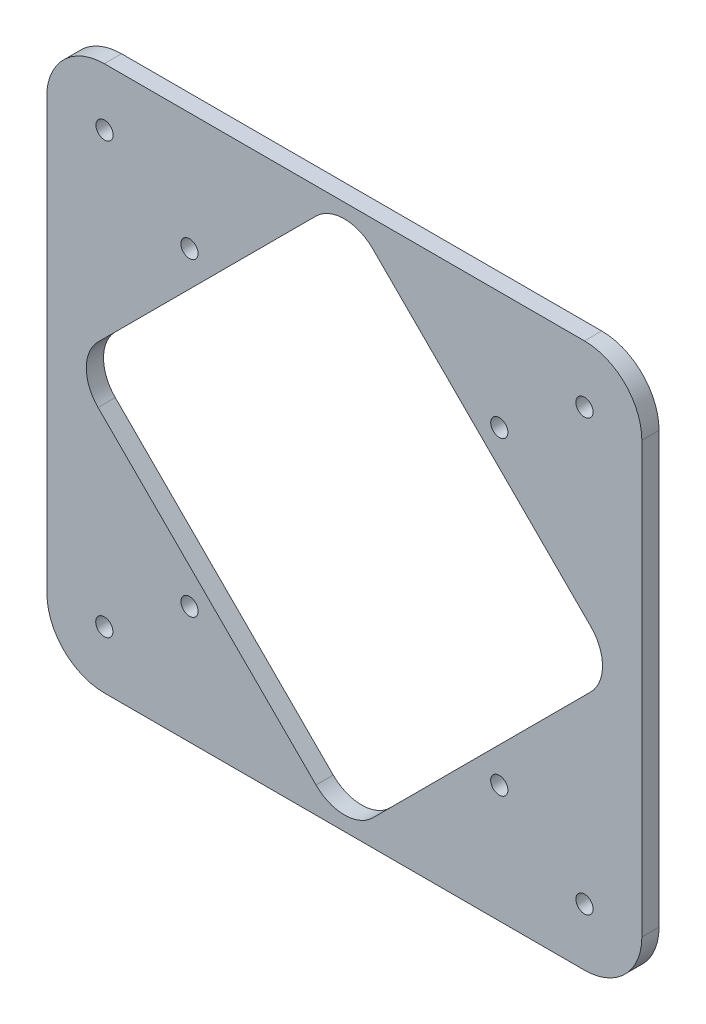
ISO-10303-21;
HEADER;
FILE_DESCRIPTION(('STEP AP214'),'2;1');
FILE_NAME('part.step','',(''),(''),'','','');
FILE_SCHEMA(('AUTOMOTIVE_DESIGN { 1 0 10303 214 1 1 1 1 }'));
ENDSEC;
DATA;
#1=APPLICATION_CONTEXT('core data for automotive mechanical design processes');
#2=APPLICATION_PROTOCOL_DEFINITION('international standard','automotive_design',2000,#1);
#3=PRODUCT_CONTEXT('',#1,'mechanical');
#4=PRODUCT('Part','Part','',(#3));
#5=PRODUCT_RELATED_PRODUCT_CATEGORY('part','',(#4));
#6=PRODUCT_DEFINITION_FORMATION('','',#4);
#7=PRODUCT_DEFINITION_CONTEXT('part definition',#1,'design');
#8=PRODUCT_DEFINITION('design','',#6,#7);
#9=PRODUCT_DEFINITION_SHAPE('','',#8);
#10=(LENGTH_UNIT() NAMED_UNIT(*) SI_UNIT(.MILLI.,.METRE.));
#11=(NAMED_UNIT(*) PLANE_ANGLE_UNIT() SI_UNIT($,.RADIAN.));
#12=(NAMED_UNIT(*) SI_UNIT($,.STERADIAN.) SOLID_ANGLE_UNIT());
#13=UNCERTAINTY_MEASURE_WITH_UNIT(LENGTH_MEASURE(1.E-05),#10,'distance_accuracy_value','');
#14=(GEOMETRIC_REPRESENTATION_CONTEXT(3) GLOBAL_UNCERTAINTY_ASSIGNED_CONTEXT((#13)) GLOBAL_UNIT_ASSIGNED_CONTEXT((#10,
#11,#12)) REPRESENTATION_CONTEXT('',''));
#15=CARTESIAN_POINT('',(0.,0.,0.));
#16=DIRECTION('',(0.,0.,1.));
#17=DIRECTION('',(1.,0.,0.));
#18=AXIS2_PLACEMENT_3D('',#15,#16,#17);
#19=CARTESIAN_POINT('',(142.00030989673,86.0001098961312,3.));
#20=DIRECTION('',(0.,0.,1.));
#21=DIRECTION('',(1.,0.,0.));
#22=AXIS2_PLACEMENT_3D('',#19,#20,#21);
#23=PLANE('',#22);
#24=CARTESIAN_POINT('',(73.150306055341,75.5000305458296,3.));
#25=DIRECTION('',(0.,0.,1.));
#26=DIRECTION('',(1.,0.,0.));
#27=AXIS2_PLACEMENT_3D('',#24,#25,#26);
#28=CIRCLE('',#27,1.5);
#29=CARTESIAN_POINT('',(74.650306055341,75.5000305458296,3.));
#30=VERTEX_POINT('',#29);
#31=EDGE_CURVE('E425',#30,#30,#28,.T.);
#32=ORIENTED_EDGE('',*,*,#31,.F.);
#33=EDGE_LOOP('',(#32));
#34=FACE_BOUND('',#33,.T.);
#35=CARTESIAN_POINT('',(142.00022454147,86.,3.));
#36=DIRECTION('',(0.,0.,1.));
#37=DIRECTION('',(1.,0.,0.));
#38=AXIS2_PLACEMENT_3D('',#35,#36,#37);
#39=CIRCLE('',#38,1.5);
#40=CARTESIAN_POINT('',(143.50022454147,86.,3.));
#41=VERTEX_POINT('',#40);
#42=EDGE_CURVE('E437',#41,#41,#39,.T.);
#43=ORIENTED_EDGE('',*,*,#42,.F.);
#44=EDGE_LOOP('',(#43));
#45=FACE_BOUND('',#44,.T.);
#46=CARTESIAN_POINT('',(142.00022454147,10.9999754582755,3.));
#47=DIRECTION('',(0.,0.,1.));
#48=DIRECTION('',(1.,0.,0.));
#49=AXIS2_PLACEMENT_3D('',#46,#47,#48);
#50=CIRCLE('',#49,1.5);
#51=CARTESIAN_POINT('',(143.50022454147,10.9999754582755,3.));
#52=VERTEX_POINT('',#51);
#53=EDGE_CURVE('E184',#52,#52,#50,.T.);
#54=ORIENTED_EDGE('',*,*,#53,.F.);
#55=EDGE_LOOP('',(#54));
#56=FACE_BOUND('',#55,.T.);
#57=CARTESIAN_POINT('',(73.150306055341,21.4999828091964,3.));
#58=DIRECTION('',(0.,0.,1.));
#59=DIRECTION('',(1.,0.,0.));
#60=AXIS2_PLACEMENT_3D('',#57,#58,#59);
#61=CIRCLE('',#60,1.5);
#62=CARTESIAN_POINT('',(74.650306055341,21.4999828091964,3.));
#63=VERTEX_POINT('',#62);
#64=EDGE_CURVE('E221',#63,#63,#61,.T.);
#65=ORIENTED_EDGE('',*,*,#64,.F.);
#66=EDGE_LOOP('',(#65));
#67=FACE_BOUND('',#66,.T.);
#68=CARTESIAN_POINT('',(142.00030989673,86.0001098961312,3.));
#69=DIRECTION('',(0.,0.,1.));
#70=DIRECTION('',(1.,0.,0.));
#71=AXIS2_PLACEMENT_3D('',#68,#69,#70);
#72=CIRCLE('',#71,9.99989010387377);
#73=CARTESIAN_POINT('',(152.0002,85.999999999886,3.));
#74=VERTEX_POINT('',#73);
#75=CARTESIAN_POINT('',(142.0003,96.0000000000001,3.));
#76=VERTEX_POINT('',#75);
#77=EDGE_CURVE('E227',#74,#76,#72,.T.);
#78=ORIENTED_EDGE('',*,*,#77,.T.);
#79=DIRECTION('',(-1.,0.,0.));
#80=VECTOR('',#79,1.);
#81=CARTESIAN_POINT('',(58.3003,95.9999999999999,3.));
#82=LINE('',#81,#80);
#83=CARTESIAN_POINT('',(58.3003,95.9999999999999,3.));
#84=VERTEX_POINT('',#83);
#85=EDGE_CURVE('E230',#76,#84,#82,.T.);
#86=ORIENTED_EDGE('',*,*,#85,.T.);
#87=CARTESIAN_POINT('',(58.3428128049057,85.8972079945477,3.));
#88=DIRECTION('',(0.,0.,1.));
#89=DIRECTION('',(1.,0.,0.));
#90=AXIS2_PLACEMENT_3D('',#87,#88,#89);
#91=CIRCLE('',#90,10.1028814525367);
#92=CARTESIAN_POINT('',(48.3002999999999,87.0000000000111,3.));
#93=VERTEX_POINT('',#92);
#94=EDGE_CURVE('E233',#84,#93,#91,.T.);
#95=ORIENTED_EDGE('',*,*,#94,.T.);
#96=DIRECTION('',(0.,-1.,0.));
#97=VECTOR('',#96,1.);
#98=CARTESIAN_POINT('',(48.3002999999999,87.0000000000111,3.));
#99=LINE('',#98,#97);
#100=CARTESIAN_POINT('',(48.3003,10.9999999999969,3.));
#101=VERTEX_POINT('',#100);
#102=EDGE_CURVE('E235',#93,#101,#99,.T.);
#103=ORIENTED_EDGE('',*,*,#102,.T.);
#104=CARTESIAN_POINT('',(58.3003608133547,11.0000608133547,3.));
#105=DIRECTION('',(0.,0.,1.));
#106=DIRECTION('',(1.,0.,0.));
#107=AXIS2_PLACEMENT_3D('',#104,#105,#106);
#108=CIRCLE('',#107,10.0000608135396);
#109=CARTESIAN_POINT('',(58.3003,1.,3.));
#110=VERTEX_POINT('',#109);
#111=EDGE_CURVE('E237',#101,#110,#108,.T.);
#112=ORIENTED_EDGE('',*,*,#111,.T.);
#113=DIRECTION('',(1.,0.,0.));
#114=VECTOR('',#113,1.);
#115=CARTESIAN_POINT('',(58.3003,1.,3.));
#116=LINE('',#115,#114);
#117=CARTESIAN_POINT('',(142.0003,0.999999999999963,3.));
#118=VERTEX_POINT('',#117);
#119=EDGE_CURVE('E239',#110,#118,#116,.T.);
#120=ORIENTED_EDGE('',*,*,#119,.T.);
#121=CARTESIAN_POINT('',(142.00022454147,10.9999754582755,3.));
#122=DIRECTION('',(0.,0.,1.));
#123=DIRECTION('',(1.,0.,0.));
#124=AXIS2_PLACEMENT_3D('',#121,#122,#123);
#125=CIRCLE('',#124,9.99997545856024);
#126=CARTESIAN_POINT('',(152.0002,10.9999999999346,3.));
#127=VERTEX_POINT('',#126);
#128=EDGE_CURVE('E241',#118,#127,#125,.T.);
#129=ORIENTED_EDGE('',*,*,#128,.T.);
#130=DIRECTION('',(0.,1.,0.));
#131=VECTOR('',#130,1.);
#132=CARTESIAN_POINT('',(152.0002,10.9999999999346,3.));
#133=LINE('',#132,#131);
#134=EDGE_CURVE('E243',#127,#74,#133,.T.);
#135=ORIENTED_EDGE('',*,*,#134,.T.);
#136=EDGE_LOOP('',(#78,#86,#95,#103,#112,#120,#129,#135));
#137=FACE_BOUND('',#136,.T.);
#138=CARTESIAN_POINT('',(58.3003,11.,3.));
#139=DIRECTION('',(0.,0.,1.));
#140=DIRECTION('',(1.,0.,0.));
#141=AXIS2_PLACEMENT_3D('',#138,#139,#140);
#142=CIRCLE('',#141,1.5);
#143=CARTESIAN_POINT('',(59.8003,11.,3.));
#144=VERTEX_POINT('',#143);
#145=EDGE_CURVE('E215',#144,#144,#142,.T.);
#146=ORIENTED_EDGE('',*,*,#145,.F.);
#147=EDGE_LOOP('',(#146));
#148=FACE_BOUND('',#147,.T.);
#149=CARTESIAN_POINT('',(138.141678028648,48.4999627321676,3.));
#150=DIRECTION('',(0.,0.,1.));
#151=DIRECTION('',(1.,0.,0.));
#152=AXIS2_PLACEMENT_3D('',#149,#150,#151);
#153=CIRCLE('',#152,7.00000000000008);
#154=CARTESIAN_POINT('',(143.091425496954,43.5502152638618,3.));
#155=VERTEX_POINT('',#154);
#156=CARTESIAN_POINT('',(143.091425496954,53.4497102004735,3.));
#157=VERTEX_POINT('',#156);
#158=EDGE_CURVE('E152',#155,#157,#153,.T.);
#159=ORIENTED_EDGE('',*,*,#158,.F.);
#160=DIRECTION('',(0.707106781186545,0.707106781186551,0.));
#161=VECTOR('',#160,1.);
#162=CARTESIAN_POINT('',(105.100047468306,5.55883723521331,3.));
#163=LINE('',#162,#161);
#164=CARTESIAN_POINT('',(105.100047468306,5.55883723521331,3.));
#165=VERTEX_POINT('',#164);
#166=EDGE_CURVE('E144',#165,#155,#163,.T.);
#167=ORIENTED_EDGE('',*,*,#166,.F.);
#168=CARTESIAN_POINT('',(100.1503,10.5085847035191,3.));
#169=DIRECTION('',(0.,0.,1.));
#170=DIRECTION('',(1.,0.,0.));
#171=AXIS2_PLACEMENT_3D('',#168,#169,#170);
#172=CIRCLE('',#171,6.99999999999999);
#173=CARTESIAN_POINT('',(95.2005525316941,5.55883723521335,3.));
#174=VERTEX_POINT('',#173);
#175=EDGE_CURVE('E180',#174,#165,#172,.T.);
#176=ORIENTED_EDGE('',*,*,#175,.F.);
#177=DIRECTION('',(0.707106781186548,-0.707106781186547,0.));
#178=VECTOR('',#177,1.);
#179=CARTESIAN_POINT('',(57.2091745030458,43.5502152638616,3.));
#180=LINE('',#179,#178);
#181=CARTESIAN_POINT('',(57.2091745030458,43.5502152638616,3.));
#182=VERTEX_POINT('',#181);
#183=EDGE_CURVE('E178',#182,#174,#180,.T.);
#184=ORIENTED_EDGE('',*,*,#183,.F.);
#185=CARTESIAN_POINT('',(62.1589219713516,48.4999627321675,3.));
#186=DIRECTION('',(0.,0.,1.));
#187=DIRECTION('',(1.,0.,0.));
#188=AXIS2_PLACEMENT_3D('',#185,#186,#187);
#189=CIRCLE('',#188,7.);
#190=CARTESIAN_POINT('',(57.2091745030457,53.4497102004733,3.));
#191=VERTEX_POINT('',#190);
#192=EDGE_CURVE('E176',#191,#182,#189,.T.);
#193=ORIENTED_EDGE('',*,*,#192,.F.);
#194=DIRECTION('',(-0.707106781186549,-0.707106781186547,0.));
#195=VECTOR('',#194,1.);
#196=CARTESIAN_POINT('',(95.2005525316942,91.4410882291217,3.));
#197=LINE('',#196,#195);
#198=CARTESIAN_POINT('',(95.2005525316942,91.4410882291217,3.));
#199=VERTEX_POINT('',#198);
#200=EDGE_CURVE('E174',#199,#191,#197,.T.);
#201=ORIENTED_EDGE('',*,*,#200,.F.);
#202=CARTESIAN_POINT('',(100.1503,86.4913407608158,3.));
#203=DIRECTION('',(0.,0.,1.));
#204=DIRECTION('',(1.,0.,0.));
#205=AXIS2_PLACEMENT_3D('',#202,#203,#204);
#206=CIRCLE('',#205,7.00000000000003);
#207=CARTESIAN_POINT('',(105.100047468306,91.4410882291217,3.));
#208=VERTEX_POINT('',#207);
#209=EDGE_CURVE('E169',#208,#199,#206,.T.);
#210=ORIENTED_EDGE('',*,*,#209,.F.);
#211=DIRECTION('',(-0.707106781186549,0.707106781186546,0.));
#212=VECTOR('',#211,1.);
#213=CARTESIAN_POINT('',(143.091425496954,53.4497102004735,3.));
#214=LINE('',#213,#212);
#215=EDGE_CURVE('E167',#157,#208,#214,.T.);
#216=ORIENTED_EDGE('',*,*,#215,.F.);
#217=EDGE_LOOP('',(#159,#167,#176,#184,#193,#201,#210,#216));
#218=FACE_BOUND('',#217,.T.);
#219=CARTESIAN_POINT('',(127.15030832697,21.4999828091964,3.));
#220=DIRECTION('',(0.,0.,1.));
#221=DIRECTION('',(1.,0.,0.));
#222=AXIS2_PLACEMENT_3D('',#219,#220,#221);
#223=CIRCLE('',#222,1.5);
#224=CARTESIAN_POINT('',(128.65030832697,21.4999828091964,3.));
#225=VERTEX_POINT('',#224);
#226=EDGE_CURVE('E443',#225,#225,#223,.T.);
#227=ORIENTED_EDGE('',*,*,#226,.F.);
#228=EDGE_LOOP('',(#227));
#229=FACE_BOUND('',#228,.T.);
#230=CARTESIAN_POINT('',(127.15030832697,75.5000305458296,3.));
#231=DIRECTION('',(0.,0.,1.));
#232=DIRECTION('',(1.,0.,0.));
#233=AXIS2_PLACEMENT_3D('',#230,#231,#232);
#234=CIRCLE('',#233,1.5);
#235=CARTESIAN_POINT('',(128.65030832697,75.5000305458296,3.));
#236=VERTEX_POINT('',#235);
#237=EDGE_CURVE('E431',#236,#236,#234,.T.);
#238=ORIENTED_EDGE('',*,*,#237,.F.);
#239=EDGE_LOOP('',(#238));
#240=FACE_BOUND('',#239,.T.);
#241=CARTESIAN_POINT('',(58.3427519915511,86.,3.));
#242=DIRECTION('',(0.,0.,1.));
#243=DIRECTION('',(1.,0.,0.));
#244=AXIS2_PLACEMENT_3D('',#241,#242,#243);
#245=CIRCLE('',#244,1.5);
#246=CARTESIAN_POINT('',(59.8427519915511,86.,3.));
#247=VERTEX_POINT('',#246);
#248=EDGE_CURVE('E416',#247,#247,#245,.T.);
#249=ORIENTED_EDGE('',*,*,#248,.F.);
#250=EDGE_LOOP('',(#249));
#251=FACE_BOUND('',#250,.T.);
#252=ADVANCED_FACE('F33',(#34,#45,#56,#67,#137,#148,#218,#229,#240,#251),#23,.T.);
#253=CARTESIAN_POINT('',(142.00030989673,86.0001098961312,0.));
#254=DIRECTION('',(0.,0.,1.));
#255=DIRECTION('',(1.,0.,0.));
#256=AXIS2_PLACEMENT_3D('',#253,#254,#255);
#257=PLANE('',#256);
#258=CARTESIAN_POINT('',(58.3003,11.,0.));
#259=DIRECTION('',(0.,0.,1.));
#260=DIRECTION('',(1.,0.,0.));
#261=AXIS2_PLACEMENT_3D('',#258,#259,#260);
#262=CIRCLE('',#261,1.5);
#263=CARTESIAN_POINT('',(59.8003,11.,0.));
#264=VERTEX_POINT('',#263);
#265=EDGE_CURVE('E161',#264,#264,#262,.T.);
#266=ORIENTED_EDGE('',*,*,#265,.T.);
#267=EDGE_LOOP('',(#266));
#268=FACE_BOUND('',#267,.T.);
#269=CARTESIAN_POINT('',(73.150306055341,21.4999828091964,0.));
#270=DIRECTION('',(0.,0.,1.));
#271=DIRECTION('',(1.,0.,0.));
#272=AXIS2_PLACEMENT_3D('',#269,#270,#271);
#273=CIRCLE('',#272,1.5);
#274=CARTESIAN_POINT('',(74.650306055341,21.4999828091964,0.));
#275=VERTEX_POINT('',#274);
#276=EDGE_CURVE('E218',#275,#275,#273,.T.);
#277=ORIENTED_EDGE('',*,*,#276,.T.);
#278=EDGE_LOOP('',(#277));
#279=FACE_BOUND('',#278,.T.);
#280=CARTESIAN_POINT('',(142.00030989673,86.0001098961312,0.));
#281=DIRECTION('',(0.,0.,1.));
#282=DIRECTION('',(1.,0.,0.));
#283=AXIS2_PLACEMENT_3D('',#280,#281,#282);
#284=CIRCLE('',#283,9.99989010387377);
#285=CARTESIAN_POINT('',(152.0002,85.999999999886,0.));
#286=VERTEX_POINT('',#285);
#287=CARTESIAN_POINT('',(142.0003,96.0000000000001,0.));
#288=VERTEX_POINT('',#287);
#289=EDGE_CURVE('E224',#286,#288,#284,.T.);
#290=ORIENTED_EDGE('',*,*,#289,.F.);
#291=DIRECTION('',(0.,1.,0.));
#292=VECTOR('',#291,1.);
#293=CARTESIAN_POINT('',(152.0002,10.9999999999346,0.));
#294=LINE('',#293,#292);
#295=CARTESIAN_POINT('',(152.0002,10.9999999999346,0.));
#296=VERTEX_POINT('',#295);
#297=EDGE_CURVE('E231',#296,#286,#294,.T.);
#298=ORIENTED_EDGE('',*,*,#297,.F.);
#299=CARTESIAN_POINT('',(142.00022454147,10.9999754582755,0.));
#300=DIRECTION('',(0.,0.,1.));
#301=DIRECTION('',(1.,0.,0.));
#302=AXIS2_PLACEMENT_3D('',#299,#300,#301);
#303=CIRCLE('',#302,9.99997545856024);
#304=CARTESIAN_POINT('',(142.0003,0.999999999999963,0.));
#305=VERTEX_POINT('',#304);
#306=EDGE_CURVE('E258',#305,#296,#303,.T.);
#307=ORIENTED_EDGE('',*,*,#306,.F.);
#308=DIRECTION('',(1.,0.,0.));
#309=VECTOR('',#308,1.);
#310=CARTESIAN_POINT('',(58.3003,1.,0.));
#311=LINE('',#310,#309);
#312=CARTESIAN_POINT('',(58.3003,1.,0.));
#313=VERTEX_POINT('',#312);
#314=EDGE_CURVE('E256',#313,#305,#311,.T.);
#315=ORIENTED_EDGE('',*,*,#314,.F.);
#316=CARTESIAN_POINT('',(58.3003608133547,11.0000608133547,0.));
#317=DIRECTION('',(0.,0.,1.));
#318=DIRECTION('',(1.,0.,0.));
#319=AXIS2_PLACEMENT_3D('',#316,#317,#318);
#320=CIRCLE('',#319,10.0000608135396);
#321=CARTESIAN_POINT('',(48.3003,10.9999999999969,0.));
#322=VERTEX_POINT('',#321);
#323=EDGE_CURVE('E254',#322,#313,#320,.T.);
#324=ORIENTED_EDGE('',*,*,#323,.F.);
#325=DIRECTION('',(0.,-1.,0.));
#326=VECTOR('',#325,1.);
#327=CARTESIAN_POINT('',(48.3002999999999,87.0000000000111,0.));
#328=LINE('',#327,#326);
#329=CARTESIAN_POINT('',(48.3002999999999,87.0000000000111,0.));
#330=VERTEX_POINT('',#329);
#331=EDGE_CURVE('E252',#330,#322,#328,.T.);
#332=ORIENTED_EDGE('',*,*,#331,.F.);
#333=CARTESIAN_POINT('',(58.3428128049057,85.8972079945477,0.));
#334=DIRECTION('',(0.,0.,1.));
#335=DIRECTION('',(1.,0.,0.));
#336=AXIS2_PLACEMENT_3D('',#333,#334,#335);
#337=CIRCLE('',#336,10.1028814525367);
#338=CARTESIAN_POINT('',(58.3003,95.9999999999999,0.));
#339=VERTEX_POINT('',#338);
#340=EDGE_CURVE('E250',#339,#330,#337,.T.);
#341=ORIENTED_EDGE('',*,*,#340,.F.);
#342=DIRECTION('',(-1.,0.,0.));
#343=VECTOR('',#342,1.);
#344=CARTESIAN_POINT('',(58.3003,95.9999999999999,0.));
#345=LINE('',#344,#343);
#346=EDGE_CURVE('E248',#288,#339,#345,.T.);
#347=ORIENTED_EDGE('',*,*,#346,.F.);
#348=EDGE_LOOP('',(#290,#298,#307,#315,#324,#332,#341,#347));
#349=FACE_BOUND('',#348,.T.);
#350=DIRECTION('',(0.70710678118655,0.707106781186545,0.));
#351=VECTOR('',#350,1.);
#352=CARTESIAN_POINT('',(124.449289873223,24.9080796401309,0.));
#353=LINE('',#352,#351);
#354=CARTESIAN_POINT('',(105.100047468306,5.55883723521331,0.));
#355=VERTEX_POINT('',#354);
#356=CARTESIAN_POINT('',(143.091425496954,43.5502152638618,0.));
#357=VERTEX_POINT('',#356);
#358=EDGE_CURVE('E182',#355,#357,#353,.T.);
#359=ORIENTED_EDGE('',*,*,#358,.T.);
#360=CARTESIAN_POINT('',(138.141678028648,48.4999627321676,0.));
#361=DIRECTION('',(0.,0.,1.));
#362=DIRECTION('',(1.,0.,0.));
#363=AXIS2_PLACEMENT_3D('',#360,#361,#362);
#364=CIRCLE('',#363,7.00000000000008);
#365=CARTESIAN_POINT('',(143.091425496954,53.4497102004735,0.));
#366=VERTEX_POINT('',#365);
#367=EDGE_CURVE('E159',#357,#366,#364,.T.);
#368=ORIENTED_EDGE('',*,*,#367,.T.);
#369=DIRECTION('',(-0.707106781186549,0.707106781186546,0.));
#370=VECTOR('',#369,1.);
#371=CARTESIAN_POINT('',(143.091425496954,53.4497102004735,0.));
#372=LINE('',#371,#370);
#373=CARTESIAN_POINT('',(105.100047468306,91.4410882291217,0.));
#374=VERTEX_POINT('',#373);
#375=EDGE_CURVE('E186',#366,#374,#372,.T.);
#376=ORIENTED_EDGE('',*,*,#375,.T.);
#377=CARTESIAN_POINT('',(100.1503,86.4913407608158,0.));
#378=DIRECTION('',(0.,0.,1.));
#379=DIRECTION('',(1.,0.,0.));
#380=AXIS2_PLACEMENT_3D('',#377,#378,#379);
#381=CIRCLE('',#380,7.00000000000003);
#382=CARTESIAN_POINT('',(95.2005525316942,91.4410882291217,0.));
#383=VERTEX_POINT('',#382);
#384=EDGE_CURVE('E189',#374,#383,#381,.T.);
#385=ORIENTED_EDGE('',*,*,#384,.T.);
#386=DIRECTION('',(-0.707106781186547,-0.707106781186548,0.));
#387=VECTOR('',#386,1.);
#388=CARTESIAN_POINT('',(76.5584169079632,72.7989526053908,0.));
#389=LINE('',#388,#387);
#390=CARTESIAN_POINT('',(57.2091745030457,53.4497102004733,0.));
#391=VERTEX_POINT('',#390);
#392=EDGE_CURVE('E192',#383,#391,#389,.T.);
#393=ORIENTED_EDGE('',*,*,#392,.T.);
#394=CARTESIAN_POINT('',(62.1589219713516,48.4999627321675,0.));
#395=DIRECTION('',(0.,0.,1.));
#396=DIRECTION('',(1.,0.,0.));
#397=AXIS2_PLACEMENT_3D('',#394,#395,#396);
#398=CIRCLE('',#397,7.);
#399=CARTESIAN_POINT('',(57.2091745030458,43.5502152638616,0.));
#400=VERTEX_POINT('',#399);
#401=EDGE_CURVE('E195',#391,#400,#398,.T.);
#402=ORIENTED_EDGE('',*,*,#401,.T.);
#403=DIRECTION('',(0.707106781186548,-0.707106781186547,0.));
#404=VECTOR('',#403,1.);
#405=CARTESIAN_POINT('',(57.2091745030458,43.5502152638616,0.));
#406=LINE('',#405,#404);
#407=CARTESIAN_POINT('',(95.2005525316941,5.55883723521335,0.));
#408=VERTEX_POINT('',#407);
#409=EDGE_CURVE('E198',#400,#408,#406,.T.);
#410=ORIENTED_EDGE('',*,*,#409,.T.);
#411=CARTESIAN_POINT('',(100.1503,10.5085847035191,0.));
#412=DIRECTION('',(0.,0.,1.));
#413=DIRECTION('',(1.,0.,0.));
#414=AXIS2_PLACEMENT_3D('',#411,#412,#413);
#415=CIRCLE('',#414,6.99999999999999);
#416=EDGE_CURVE('E153',#408,#355,#415,.T.);
#417=ORIENTED_EDGE('',*,*,#416,.T.);
#418=EDGE_LOOP('',(#359,#368,#376,#385,#393,#402,#410,#417));
#419=FACE_BOUND('',#418,.T.);
#420=CARTESIAN_POINT('',(142.00022454147,10.9999754582755,0.));
#421=DIRECTION('',(0.,0.,1.));
#422=DIRECTION('',(1.,0.,0.));
#423=AXIS2_PLACEMENT_3D('',#420,#421,#422);
#424=CIRCLE('',#423,1.5);
#425=CARTESIAN_POINT('',(143.50022454147,10.9999754582755,0.));
#426=VERTEX_POINT('',#425);
#427=EDGE_CURVE('E446',#426,#426,#424,.T.);
#428=ORIENTED_EDGE('',*,*,#427,.T.);
#429=EDGE_LOOP('',(#428));
#430=FACE_BOUND('',#429,.T.);
#431=CARTESIAN_POINT('',(127.15030832697,21.4999828091964,0.));
#432=DIRECTION('',(0.,0.,1.));
#433=DIRECTION('',(1.,0.,0.));
#434=AXIS2_PLACEMENT_3D('',#431,#432,#433);
#435=CIRCLE('',#434,1.5);
#436=CARTESIAN_POINT('',(128.65030832697,21.4999828091964,0.));
#437=VERTEX_POINT('',#436);
#438=EDGE_CURVE('E440',#437,#437,#435,.T.);
#439=ORIENTED_EDGE('',*,*,#438,.T.);
#440=EDGE_LOOP('',(#439));
#441=FACE_BOUND('',#440,.T.);
#442=CARTESIAN_POINT('',(142.00022454147,86.,0.));
#443=DIRECTION('',(0.,0.,1.));
#444=DIRECTION('',(1.,0.,0.));
#445=AXIS2_PLACEMENT_3D('',#442,#443,#444);
#446=CIRCLE('',#445,1.5);
#447=CARTESIAN_POINT('',(143.50022454147,86.,0.));
#448=VERTEX_POINT('',#447);
#449=EDGE_CURVE('E434',#448,#448,#446,.T.);
#450=ORIENTED_EDGE('',*,*,#449,.T.);
#451=EDGE_LOOP('',(#450));
#452=FACE_BOUND('',#451,.T.);
#453=CARTESIAN_POINT('',(127.15030832697,75.5000305458296,0.));
#454=DIRECTION('',(0.,0.,1.));
#455=DIRECTION('',(1.,0.,0.));
#456=AXIS2_PLACEMENT_3D('',#453,#454,#455);
#457=CIRCLE('',#456,1.5);
#458=CARTESIAN_POINT('',(128.65030832697,75.5000305458296,0.));
#459=VERTEX_POINT('',#458);
#460=EDGE_CURVE('E428',#459,#459,#457,.T.);
#461=ORIENTED_EDGE('',*,*,#460,.T.);
#462=EDGE_LOOP('',(#461));
#463=FACE_BOUND('',#462,.T.);
#464=CARTESIAN_POINT('',(73.150306055341,75.5000305458296,0.));
#465=DIRECTION('',(0.,0.,1.));
#466=DIRECTION('',(1.,0.,0.));
#467=AXIS2_PLACEMENT_3D('',#464,#465,#466);
#468=CIRCLE('',#467,1.5);
#469=CARTESIAN_POINT('',(74.650306055341,75.5000305458296,0.));
#470=VERTEX_POINT('',#469);
#471=EDGE_CURVE('E422',#470,#470,#468,.T.);
#472=ORIENTED_EDGE('',*,*,#471,.T.);
#473=EDGE_LOOP('',(#472));
#474=FACE_BOUND('',#473,.T.);
#475=CARTESIAN_POINT('',(58.3427519915511,86.,0.));
#476=DIRECTION('',(0.,0.,1.));
#477=DIRECTION('',(1.,0.,0.));
#478=AXIS2_PLACEMENT_3D('',#475,#476,#477);
#479=CIRCLE('',#478,1.5);
#480=CARTESIAN_POINT('',(59.8427519915511,86.,0.));
#481=VERTEX_POINT('',#480);
#482=EDGE_CURVE('E419',#481,#481,#479,.T.);
#483=ORIENTED_EDGE('',*,*,#482,.T.);
#484=EDGE_LOOP('',(#483));
#485=FACE_BOUND('',#484,.T.);
#486=ADVANCED_FACE('F288',(#268,#279,#349,#419,#430,#441,#452,#463,#474,#485),#257,.F.);
#487=CARTESIAN_POINT('',(142.00030989673,86.0001098961312,3.));
#488=DIRECTION('',(0.,0.,-1.));
#489=DIRECTION('',(-1.,0.,0.));
#490=AXIS2_PLACEMENT_3D('',#487,#488,#489);
#491=CYLINDRICAL_SURFACE('',#490,9.99989010387377);
#492=ORIENTED_EDGE('',*,*,#289,.T.);
#493=DIRECTION('',(0.,0.,-1.));
#494=VECTOR('',#493,1.);
#495=CARTESIAN_POINT('',(142.0003,96.0000000000001,3.));
#496=LINE('',#495,#494);
#497=EDGE_CURVE('E11',#76,#288,#496,.T.);
#498=ORIENTED_EDGE('',*,*,#497,.F.);
#499=ORIENTED_EDGE('',*,*,#77,.F.);
#500=DIRECTION('',(0.,0.,-1.));
#501=VECTOR('',#500,1.);
#502=CARTESIAN_POINT('',(152.0002,85.999999999886,3.));
#503=LINE('',#502,#501);
#504=EDGE_CURVE('E245',#74,#286,#503,.T.);
#505=ORIENTED_EDGE('',*,*,#504,.T.);
#506=EDGE_LOOP('',(#492,#498,#499,#505));
#507=FACE_BOUND('',#506,.T.);
#508=ADVANCED_FACE('F35',(#507),#491,.T.);
#509=CARTESIAN_POINT('',(58.3003,95.9999999999999,3.));
#510=DIRECTION('',(0.,-1.,0.));
#511=DIRECTION('',(1.,0.,0.));
#512=AXIS2_PLACEMENT_3D('',#509,#510,#511);
#513=PLANE('',#512);
#514=ORIENTED_EDGE('',*,*,#346,.T.);
#515=DIRECTION('',(0.,0.,-1.));
#516=VECTOR('',#515,1.);
#517=CARTESIAN_POINT('',(58.3003,95.9999999999999,3.));
#518=LINE('',#517,#516);
#519=EDGE_CURVE('E41',#84,#339,#518,.T.);
#520=ORIENTED_EDGE('',*,*,#519,.F.);
#521=ORIENTED_EDGE('',*,*,#85,.F.);
#522=ORIENTED_EDGE('',*,*,#497,.T.);
#523=EDGE_LOOP('',(#514,#520,#521,#522));
#524=FACE_BOUND('',#523,.T.);
#525=ADVANCED_FACE('F306',(#524),#513,.F.);
#526=CARTESIAN_POINT('',(58.3428128049057,85.8972079945477,3.));
#527=DIRECTION('',(0.,0.,-1.));
#528=DIRECTION('',(-1.,0.,0.));
#529=AXIS2_PLACEMENT_3D('',#526,#527,#528);
#530=CYLINDRICAL_SURFACE('',#529,10.1028814525367);
#531=ORIENTED_EDGE('',*,*,#340,.T.);
#532=DIRECTION('',(0.,0.,-1.));
#533=VECTOR('',#532,1.);
#534=CARTESIAN_POINT('',(48.3002999999999,87.0000000000111,3.));
#535=LINE('',#534,#533);
#536=EDGE_CURVE('E275',#93,#330,#535,.T.);
#537=ORIENTED_EDGE('',*,*,#536,.F.);
#538=ORIENTED_EDGE('',*,*,#94,.F.);
#539=ORIENTED_EDGE('',*,*,#519,.T.);
#540=EDGE_LOOP('',(#531,#537,#538,#539));
#541=FACE_BOUND('',#540,.T.);
#542=ADVANCED_FACE('F282',(#541),#530,.T.);
#543=CARTESIAN_POINT('',(48.3002999999999,87.0000000000111,3.));
#544=DIRECTION('',(1.,0.,0.));
#545=DIRECTION('',(0.,1.,0.));
#546=AXIS2_PLACEMENT_3D('',#543,#544,#545);
#547=PLANE('',#546);
#548=ORIENTED_EDGE('',*,*,#331,.T.);
#549=DIRECTION('',(0.,0.,-1.));
#550=VECTOR('',#549,1.);
#551=CARTESIAN_POINT('',(48.3003,10.9999999999969,3.));
#552=LINE('',#551,#550);
#553=EDGE_CURVE('E272',#101,#322,#552,.T.);
#554=ORIENTED_EDGE('',*,*,#553,.F.);
#555=ORIENTED_EDGE('',*,*,#102,.F.);
#556=ORIENTED_EDGE('',*,*,#536,.T.);
#557=EDGE_LOOP('',(#548,#554,#555,#556));
#558=FACE_BOUND('',#557,.T.);
#559=ADVANCED_FACE('F294',(#558),#547,.F.);
#560=CARTESIAN_POINT('',(58.3003608133547,11.0000608133547,3.));
#561=DIRECTION('',(0.,0.,-1.));
#562=DIRECTION('',(-1.,0.,0.));
#563=AXIS2_PLACEMENT_3D('',#560,#561,#562);
#564=CYLINDRICAL_SURFACE('',#563,10.0000608135396);
#565=ORIENTED_EDGE('',*,*,#323,.T.);
#566=DIRECTION('',(0.,0.,-1.));
#567=VECTOR('',#566,1.);
#568=CARTESIAN_POINT('',(58.3003,1.,3.));
#569=LINE('',#568,#567);
#570=EDGE_CURVE('E269',#110,#313,#569,.T.);
#571=ORIENTED_EDGE('',*,*,#570,.F.);
#572=ORIENTED_EDGE('',*,*,#111,.F.);
#573=ORIENTED_EDGE('',*,*,#553,.T.);
#574=EDGE_LOOP('',(#565,#571,#572,#573));
#575=FACE_BOUND('',#574,.T.);
#576=ADVANCED_FACE('F298',(#575),#564,.T.);
#577=CARTESIAN_POINT('',(58.3003,1.,3.));
#578=DIRECTION('',(0.,1.,0.));
#579=DIRECTION('',(-1.,0.,0.));
#580=AXIS2_PLACEMENT_3D('',#577,#578,#579);
#581=PLANE('',#580);
#582=ORIENTED_EDGE('',*,*,#314,.T.);
#583=DIRECTION('',(0.,0.,-1.));
#584=VECTOR('',#583,1.);
#585=CARTESIAN_POINT('',(142.0003,0.999999999999963,3.));
#586=LINE('',#585,#584);
#587=EDGE_CURVE('E266',#118,#305,#586,.T.);
#588=ORIENTED_EDGE('',*,*,#587,.F.);
#589=ORIENTED_EDGE('',*,*,#119,.F.);
#590=ORIENTED_EDGE('',*,*,#570,.T.);
#591=EDGE_LOOP('',(#582,#588,#589,#590));
#592=FACE_BOUND('',#591,.T.);
#593=ADVANCED_FACE('F319',(#592),#581,.F.);
#594=CARTESIAN_POINT('',(142.00022454147,10.9999754582755,3.));
#595=DIRECTION('',(0.,0.,-1.));
#596=DIRECTION('',(-1.,0.,0.));
#597=AXIS2_PLACEMENT_3D('',#594,#595,#596);
#598=CYLINDRICAL_SURFACE('',#597,9.99997545856024);
#599=ORIENTED_EDGE('',*,*,#306,.T.);
#600=DIRECTION('',(0.,0.,-1.));
#601=VECTOR('',#600,1.);
#602=CARTESIAN_POINT('',(152.0002,10.9999999999346,3.));
#603=LINE('',#602,#601);
#604=EDGE_CURVE('E263',#127,#296,#603,.T.);
#605=ORIENTED_EDGE('',*,*,#604,.F.);
#606=ORIENTED_EDGE('',*,*,#128,.F.);
#607=ORIENTED_EDGE('',*,*,#587,.T.);
#608=EDGE_LOOP('',(#599,#605,#606,#607));
#609=FACE_BOUND('',#608,.T.);
#610=ADVANCED_FACE('F317',(#609),#598,.T.);
#611=CARTESIAN_POINT('',(152.0002,10.9999999999346,3.));
#612=DIRECTION('',(-1.,0.,0.));
#613=DIRECTION('',(0.,-1.,0.));
#614=AXIS2_PLACEMENT_3D('',#611,#612,#613);
#615=PLANE('',#614);
#616=ORIENTED_EDGE('',*,*,#297,.T.);
#617=ORIENTED_EDGE('',*,*,#504,.F.);
#618=ORIENTED_EDGE('',*,*,#134,.F.);
#619=ORIENTED_EDGE('',*,*,#604,.T.);
#620=EDGE_LOOP('',(#616,#617,#618,#619));
#621=FACE_BOUND('',#620,.T.);
#622=ADVANCED_FACE('F312',(#621),#615,.F.);
#623=CARTESIAN_POINT('',(73.150306055341,21.4999828091964,3.));
#624=DIRECTION('',(0.,0.,-1.));
#625=DIRECTION('',(-1.,0.,0.));
#626=AXIS2_PLACEMENT_3D('',#623,#624,#625);
#627=CYLINDRICAL_SURFACE('',#626,1.5);
#628=ORIENTED_EDGE('',*,*,#64,.T.);
#629=EDGE_LOOP('',(#628));
#630=FACE_BOUND('',#629,.T.);
#631=ORIENTED_EDGE('',*,*,#276,.F.);
#632=EDGE_LOOP('',(#631));
#633=FACE_BOUND('',#632,.T.);
#634=ADVANCED_FACE('F339',(#630,#633),#627,.F.);
#635=CARTESIAN_POINT('',(58.3003,11.,3.));
#636=DIRECTION('',(0.,0.,-1.));
#637=DIRECTION('',(-1.,0.,0.));
#638=AXIS2_PLACEMENT_3D('',#635,#636,#637);
#639=CYLINDRICAL_SURFACE('',#638,1.5);
#640=ORIENTED_EDGE('',*,*,#145,.T.);
#641=EDGE_LOOP('',(#640));
#642=FACE_BOUND('',#641,.T.);
#643=ORIENTED_EDGE('',*,*,#265,.F.);
#644=EDGE_LOOP('',(#643));
#645=FACE_BOUND('',#644,.T.);
#646=ADVANCED_FACE('F346',(#642,#645),#639,.F.);
#647=CARTESIAN_POINT('',(124.449289873223,24.9080796401309,3.));
#648=DIRECTION('',(-0.707106781186545,0.70710678118655,0.));
#649=DIRECTION('',(-0.70710678118655,-0.707106781186545,0.));
#650=AXIS2_PLACEMENT_3D('',#647,#648,#649);
#651=PLANE('',#650);
#652=ORIENTED_EDGE('',*,*,#358,.F.);
#653=DIRECTION('',(0.,0.,-1.));
#654=VECTOR('',#653,1.);
#655=CARTESIAN_POINT('',(105.100047468306,5.55883723521331,3.));
#656=LINE('',#655,#654);
#657=EDGE_CURVE('E53',#165,#355,#656,.T.);
#658=ORIENTED_EDGE('',*,*,#657,.F.);
#659=ORIENTED_EDGE('',*,*,#166,.T.);
#660=DIRECTION('',(0.,0.,-1.));
#661=VECTOR('',#660,1.);
#662=CARTESIAN_POINT('',(143.091425496954,43.5502152638618,3.));
#663=LINE('',#662,#661);
#664=EDGE_CURVE('E147',#155,#357,#663,.T.);
#665=ORIENTED_EDGE('',*,*,#664,.T.);
#666=EDGE_LOOP('',(#652,#658,#659,#665));
#667=FACE_BOUND('',#666,.T.);
#668=ADVANCED_FACE('F146',(#667),#651,.T.);
#669=CARTESIAN_POINT('',(138.141678028648,48.4999627321676,3.));
#670=DIRECTION('',(0.,0.,-1.));
#671=DIRECTION('',(-1.,0.,0.));
#672=AXIS2_PLACEMENT_3D('',#669,#670,#671);
#673=CYLINDRICAL_SURFACE('',#672,7.00000000000008);
#674=ORIENTED_EDGE('',*,*,#367,.F.);
#675=ORIENTED_EDGE('',*,*,#664,.F.);
#676=ORIENTED_EDGE('',*,*,#158,.T.);
#677=DIRECTION('',(0.,0.,-1.));
#678=VECTOR('',#677,1.);
#679=CARTESIAN_POINT('',(143.091425496954,53.4497102004735,3.));
#680=LINE('',#679,#678);
#681=EDGE_CURVE('E162',#157,#366,#680,.T.);
#682=ORIENTED_EDGE('',*,*,#681,.T.);
#683=EDGE_LOOP('',(#674,#675,#676,#682));
#684=FACE_BOUND('',#683,.T.);
#685=ADVANCED_FACE('F156',(#684),#673,.F.);
#686=CARTESIAN_POINT('',(143.091425496954,53.4497102004735,3.));
#687=DIRECTION('',(-0.707106781186546,-0.707106781186549,0.));
#688=DIRECTION('',(0.707106781186549,-0.707106781186546,0.));
#689=AXIS2_PLACEMENT_3D('',#686,#687,#688);
#690=PLANE('',#689);
#691=ORIENTED_EDGE('',*,*,#375,.F.);
#692=ORIENTED_EDGE('',*,*,#681,.F.);
#693=ORIENTED_EDGE('',*,*,#215,.T.);
#694=DIRECTION('',(0.,0.,-1.));
#695=VECTOR('',#694,1.);
#696=CARTESIAN_POINT('',(105.100047468306,91.4410882291217,3.));
#697=LINE('',#696,#695);
#698=EDGE_CURVE('E212',#208,#374,#697,.T.);
#699=ORIENTED_EDGE('',*,*,#698,.T.);
#700=EDGE_LOOP('',(#691,#692,#693,#699));
#701=FACE_BOUND('',#700,.T.);
#702=ADVANCED_FACE('F365',(#701),#690,.T.);
#703=CARTESIAN_POINT('',(100.1503,86.4913407608158,3.));
#704=DIRECTION('',(0.,0.,-1.));
#705=DIRECTION('',(-1.,0.,0.));
#706=AXIS2_PLACEMENT_3D('',#703,#704,#705);
#707=CYLINDRICAL_SURFACE('',#706,7.00000000000003);
#708=ORIENTED_EDGE('',*,*,#384,.F.);
#709=ORIENTED_EDGE('',*,*,#698,.F.);
#710=ORIENTED_EDGE('',*,*,#209,.T.);
#711=DIRECTION('',(0.,0.,-1.));
#712=VECTOR('',#711,1.);
#713=CARTESIAN_POINT('',(95.2005525316942,91.4410882291217,3.));
#714=LINE('',#713,#712);
#715=EDGE_CURVE('E209',#199,#383,#714,.T.);
#716=ORIENTED_EDGE('',*,*,#715,.T.);
#717=EDGE_LOOP('',(#708,#709,#710,#716));
#718=FACE_BOUND('',#717,.T.);
#719=ADVANCED_FACE('F368',(#718),#707,.F.);
#720=CARTESIAN_POINT('',(76.5584169079632,72.7989526053908,3.));
#721=DIRECTION('',(0.707106781186548,-0.707106781186547,0.));
#722=DIRECTION('',(0.707106781186547,0.707106781186548,0.));
#723=AXIS2_PLACEMENT_3D('',#720,#721,#722);
#724=PLANE('',#723);
#725=ORIENTED_EDGE('',*,*,#392,.F.);
#726=ORIENTED_EDGE('',*,*,#715,.F.);
#727=ORIENTED_EDGE('',*,*,#200,.T.);
#728=DIRECTION('',(0.,0.,-1.));
#729=VECTOR('',#728,1.);
#730=CARTESIAN_POINT('',(57.2091745030457,53.4497102004733,3.));
#731=LINE('',#730,#729);
#732=EDGE_CURVE('E207',#191,#391,#731,.T.);
#733=ORIENTED_EDGE('',*,*,#732,.T.);
#734=EDGE_LOOP('',(#725,#726,#727,#733));
#735=FACE_BOUND('',#734,.T.);
#736=ADVANCED_FACE('F372',(#735),#724,.T.);
#737=CARTESIAN_POINT('',(62.1589219713516,48.4999627321675,3.));
#738=DIRECTION('',(0.,0.,-1.));
#739=DIRECTION('',(-1.,0.,0.));
#740=AXIS2_PLACEMENT_3D('',#737,#738,#739);
#741=CYLINDRICAL_SURFACE('',#740,7.);
#742=ORIENTED_EDGE('',*,*,#401,.F.);
#743=ORIENTED_EDGE('',*,*,#732,.F.);
#744=ORIENTED_EDGE('',*,*,#192,.T.);
#745=DIRECTION('',(0.,0.,-1.));
#746=VECTOR('',#745,1.);
#747=CARTESIAN_POINT('',(57.2091745030458,43.5502152638616,3.));
#748=LINE('',#747,#746);
#749=EDGE_CURVE('E205',#182,#400,#748,.T.);
#750=ORIENTED_EDGE('',*,*,#749,.T.);
#751=EDGE_LOOP('',(#742,#743,#744,#750));
#752=FACE_BOUND('',#751,.T.);
#753=ADVANCED_FACE('F376',(#752),#741,.F.);
#754=CARTESIAN_POINT('',(57.2091745030458,43.5502152638616,3.));
#755=DIRECTION('',(0.707106781186547,0.707106781186548,0.));
#756=DIRECTION('',(-0.707106781186548,0.707106781186547,0.));
#757=AXIS2_PLACEMENT_3D('',#754,#755,#756);
#758=PLANE('',#757);
#759=ORIENTED_EDGE('',*,*,#409,.F.);
#760=ORIENTED_EDGE('',*,*,#749,.F.);
#761=ORIENTED_EDGE('',*,*,#183,.T.);
#762=DIRECTION('',(0.,0.,-1.));
#763=VECTOR('',#762,1.);
#764=CARTESIAN_POINT('',(95.2005525316941,5.55883723521335,3.));
#765=LINE('',#764,#763);
#766=EDGE_CURVE('E48',#174,#408,#765,.T.);
#767=ORIENTED_EDGE('',*,*,#766,.T.);
#768=EDGE_LOOP('',(#759,#760,#761,#767));
#769=FACE_BOUND('',#768,.T.);
#770=ADVANCED_FACE('F380',(#769),#758,.T.);
#771=CARTESIAN_POINT('',(100.1503,10.5085847035191,3.));
#772=DIRECTION('',(0.,0.,-1.));
#773=DIRECTION('',(-1.,0.,0.));
#774=AXIS2_PLACEMENT_3D('',#771,#772,#773);
#775=CYLINDRICAL_SURFACE('',#774,6.99999999999999);
#776=ORIENTED_EDGE('',*,*,#416,.F.);
#777=ORIENTED_EDGE('',*,*,#766,.F.);
#778=ORIENTED_EDGE('',*,*,#175,.T.);
#779=ORIENTED_EDGE('',*,*,#657,.T.);
#780=EDGE_LOOP('',(#776,#777,#778,#779));
#781=FACE_BOUND('',#780,.T.);
#782=ADVANCED_FACE('F384',(#781),#775,.F.);
#783=CARTESIAN_POINT('',(142.00022454147,10.9999754582755,3.));
#784=DIRECTION('',(0.,0.,-1.));
#785=DIRECTION('',(-1.,0.,0.));
#786=AXIS2_PLACEMENT_3D('',#783,#784,#785);
#787=CYLINDRICAL_SURFACE('',#786,1.5);
#788=ORIENTED_EDGE('',*,*,#53,.T.);
#789=EDGE_LOOP('',(#788));
#790=FACE_BOUND('',#789,.T.);
#791=ORIENTED_EDGE('',*,*,#427,.F.);
#792=EDGE_LOOP('',(#791));
#793=FACE_BOUND('',#792,.T.);
#794=ADVANCED_FACE('F388',(#790,#793),#787,.F.);
#795=CARTESIAN_POINT('',(127.15030832697,21.4999828091964,3.));
#796=DIRECTION('',(0.,0.,-1.));
#797=DIRECTION('',(-1.,0.,0.));
#798=AXIS2_PLACEMENT_3D('',#795,#796,#797);
#799=CYLINDRICAL_SURFACE('',#798,1.5);
#800=ORIENTED_EDGE('',*,*,#226,.T.);
#801=EDGE_LOOP('',(#800));
#802=FACE_BOUND('',#801,.T.);
#803=ORIENTED_EDGE('',*,*,#438,.F.);
#804=EDGE_LOOP('',(#803));
#805=FACE_BOUND('',#804,.T.);
#806=ADVANCED_FACE('F391',(#802,#805),#799,.F.);
#807=CARTESIAN_POINT('',(142.00022454147,86.,3.));
#808=DIRECTION('',(0.,0.,-1.));
#809=DIRECTION('',(-1.,0.,0.));
#810=AXIS2_PLACEMENT_3D('',#807,#808,#809);
#811=CYLINDRICAL_SURFACE('',#810,1.5);
#812=ORIENTED_EDGE('',*,*,#42,.T.);
#813=EDGE_LOOP('',(#812));
#814=FACE_BOUND('',#813,.T.);
#815=ORIENTED_EDGE('',*,*,#449,.F.);
#816=EDGE_LOOP('',(#815));
#817=FACE_BOUND('',#816,.T.);
#818=ADVANCED_FACE('F395',(#814,#817),#811,.F.);
#819=CARTESIAN_POINT('',(127.15030832697,75.5000305458296,3.));
#820=DIRECTION('',(0.,0.,-1.));
#821=DIRECTION('',(-1.,0.,0.));
#822=AXIS2_PLACEMENT_3D('',#819,#820,#821);
#823=CYLINDRICAL_SURFACE('',#822,1.5);
#824=ORIENTED_EDGE('',*,*,#237,.T.);
#825=EDGE_LOOP('',(#824));
#826=FACE_BOUND('',#825,.T.);
#827=ORIENTED_EDGE('',*,*,#460,.F.);
#828=EDGE_LOOP('',(#827));
#829=FACE_BOUND('',#828,.T.);
#830=ADVANCED_FACE('F399',(#826,#829),#823,.F.);
#831=CARTESIAN_POINT('',(73.150306055341,75.5000305458296,3.));
#832=DIRECTION('',(0.,0.,-1.));
#833=DIRECTION('',(-1.,0.,0.));
#834=AXIS2_PLACEMENT_3D('',#831,#832,#833);
#835=CYLINDRICAL_SURFACE('',#834,1.5);
#836=ORIENTED_EDGE('',*,*,#31,.T.);
#837=EDGE_LOOP('',(#836));
#838=FACE_BOUND('',#837,.T.);
#839=ORIENTED_EDGE('',*,*,#471,.F.);
#840=EDGE_LOOP('',(#839));
#841=FACE_BOUND('',#840,.T.);
#842=ADVANCED_FACE('F403',(#838,#841),#835,.F.);
#843=CARTESIAN_POINT('',(58.3427519915511,86.,3.));
#844=DIRECTION('',(0.,0.,-1.));
#845=DIRECTION('',(-1.,0.,0.));
#846=AXIS2_PLACEMENT_3D('',#843,#844,#845);
#847=CYLINDRICAL_SURFACE('',#846,1.5);
#848=ORIENTED_EDGE('',*,*,#248,.T.);
#849=EDGE_LOOP('',(#848));
#850=FACE_BOUND('',#849,.T.);
#851=ORIENTED_EDGE('',*,*,#482,.F.);
#852=EDGE_LOOP('',(#851));
#853=FACE_BOUND('',#852,.T.);
#854=ADVANCED_FACE('F407',(#850,#853),#847,.F.);
#855=CLOSED_SHELL('',(#252,#486,#508,#525,#542,#559,#576,#593,#610,#622,#634,#646,#668,#685,
#702,#719,#736,#753,#770,#782,#794,#806,#818,#830,#842,#854));
#856=MANIFOLD_SOLID_BREP('B2',#855);
#857=ADVANCED_BREP_SHAPE_REPRESENTATION('',(#18,#856),#14);
#858=SHAPE_DEFINITION_REPRESENTATION(#9,#857);
ENDSEC;
END-ISO-10303-21;
